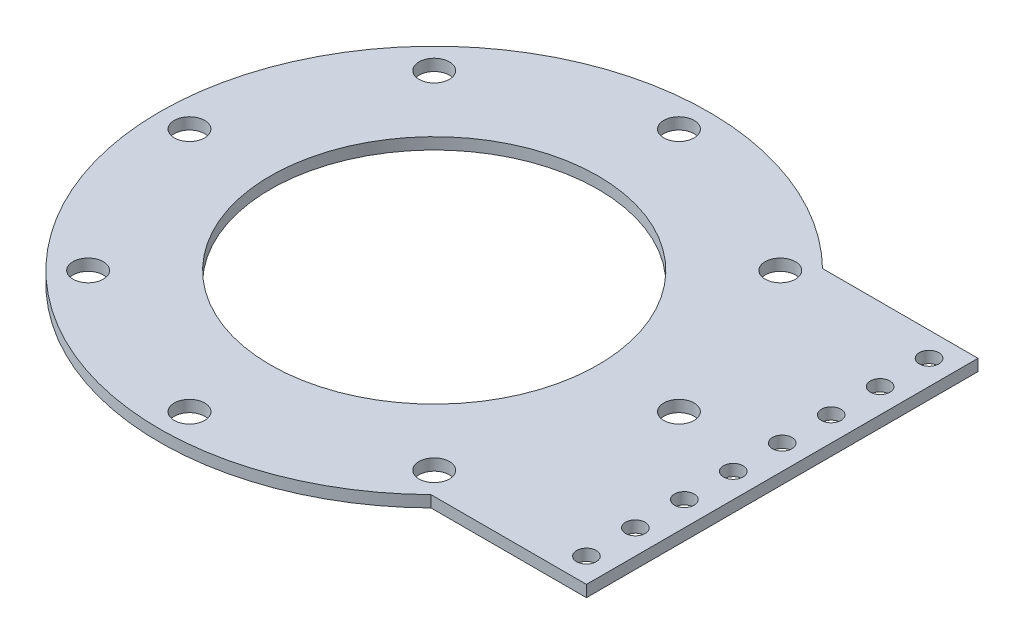
ISO-10303-21;
HEADER;
FILE_DESCRIPTION(('STEP AP214'),'2;1');
FILE_NAME('part.step','',(''),(''),'','','');
FILE_SCHEMA(('AUTOMOTIVE_DESIGN { 1 0 10303 214 1 1 1 1 }'));
ENDSEC;
DATA;
#1=APPLICATION_CONTEXT('core data for automotive mechanical design processes');
#2=APPLICATION_PROTOCOL_DEFINITION('international standard','automotive_design',2000,#1);
#3=PRODUCT_CONTEXT('',#1,'mechanical');
#4=PRODUCT('Part','Part','',(#3));
#5=PRODUCT_RELATED_PRODUCT_CATEGORY('part','',(#4));
#6=PRODUCT_DEFINITION_FORMATION('','',#4);
#7=PRODUCT_DEFINITION_CONTEXT('part definition',#1,'design');
#8=PRODUCT_DEFINITION('design','',#6,#7);
#9=PRODUCT_DEFINITION_SHAPE('','',#8);
#10=(LENGTH_UNIT() NAMED_UNIT(*) SI_UNIT(.MILLI.,.METRE.));
#11=(NAMED_UNIT(*) PLANE_ANGLE_UNIT() SI_UNIT($,.RADIAN.));
#12=(NAMED_UNIT(*) SI_UNIT($,.STERADIAN.) SOLID_ANGLE_UNIT());
#13=UNCERTAINTY_MEASURE_WITH_UNIT(LENGTH_MEASURE(1.E-05),#10,'distance_accuracy_value','');
#14=(GEOMETRIC_REPRESENTATION_CONTEXT(3) GLOBAL_UNCERTAINTY_ASSIGNED_CONTEXT((#13)) GLOBAL_UNIT_ASSIGNED_CONTEXT((#10,
#11,#12)) REPRESENTATION_CONTEXT('',''));
#15=CARTESIAN_POINT('',(0.,0.,0.));
#16=DIRECTION('',(0.,0.,1.));
#17=DIRECTION('',(1.,0.,0.));
#18=AXIS2_PLACEMENT_3D('',#15,#16,#17);
#19=CARTESIAN_POINT('',(0.,0.6,0.));
#20=DIRECTION('',(0.,-1.,0.));
#21=DIRECTION('',(0.,0.,-1.));
#22=AXIS2_PLACEMENT_3D('',#19,#20,#21);
#23=CYLINDRICAL_SURFACE('',#22,14.25);
#24=CARTESIAN_POINT('',(0.,0.,0.));
#25=DIRECTION('',(0.,1.,0.));
#26=DIRECTION('',(0.,0.,1.));
#27=AXIS2_PLACEMENT_3D('',#24,#25,#26);
#28=CIRCLE('',#27,14.25);
#29=CARTESIAN_POINT('',(9.99184167208428,0.,-10.16));
#30=VERTEX_POINT('',#29);
#31=CARTESIAN_POINT('',(9.99184167208428,0.,10.16));
#32=VERTEX_POINT('',#31);
#33=EDGE_CURVE('E151',#30,#32,#28,.T.);
#34=ORIENTED_EDGE('',*,*,#33,.T.);
#35=DIRECTION('',(0.,-1.,0.));
#36=VECTOR('',#35,1.);
#37=CARTESIAN_POINT('',(9.99184167208428,0.6,10.16));
#38=LINE('',#37,#36);
#39=CARTESIAN_POINT('',(9.99184167208428,0.6,10.16));
#40=VERTEX_POINT('',#39);
#41=EDGE_CURVE('E11',#40,#32,#38,.T.);
#42=ORIENTED_EDGE('',*,*,#41,.F.);
#43=CARTESIAN_POINT('',(0.,0.6,0.));
#44=DIRECTION('',(0.,1.,0.));
#45=DIRECTION('',(0.,0.,1.));
#46=AXIS2_PLACEMENT_3D('',#43,#44,#45);
#47=CIRCLE('',#46,14.25);
#48=CARTESIAN_POINT('',(9.99184167208428,0.6,-10.16));
#49=VERTEX_POINT('',#48);
#50=EDGE_CURVE('E86',#49,#40,#47,.T.);
#51=ORIENTED_EDGE('',*,*,#50,.F.);
#52=DIRECTION('',(0.,-1.,0.));
#53=VECTOR('',#52,1.);
#54=CARTESIAN_POINT('',(9.99184167208428,0.6,-10.16));
#55=LINE('',#54,#53);
#56=EDGE_CURVE('E52',#49,#30,#55,.T.);
#57=ORIENTED_EDGE('',*,*,#56,.T.);
#58=EDGE_LOOP('',(#34,#42,#51,#57));
#59=FACE_BOUND('',#58,.T.);
#60=ADVANCED_FACE('F35',(#59),#23,.T.);
#61=CARTESIAN_POINT('',(0.,0.6,10.16));
#62=DIRECTION('',(0.,0.,-1.));
#63=DIRECTION('',(-1.,0.,0.));
#64=AXIS2_PLACEMENT_3D('',#61,#62,#63);
#65=PLANE('',#64);
#66=DIRECTION('',(1.,0.,0.));
#67=VECTOR('',#66,1.);
#68=CARTESIAN_POINT('',(0.,0.,10.16));
#69=LINE('',#68,#67);
#70=CARTESIAN_POINT('',(18.0599999999999,0.,10.16));
#71=VERTEX_POINT('',#70);
#72=EDGE_CURVE('E91',#32,#71,#69,.T.);
#73=ORIENTED_EDGE('',*,*,#72,.T.);
#74=DIRECTION('',(0.,-1.,0.));
#75=VECTOR('',#74,1.);
#76=CARTESIAN_POINT('',(18.0599999999999,0.6,10.16));
#77=LINE('',#76,#75);
#78=CARTESIAN_POINT('',(18.0599999999999,0.6,10.16));
#79=VERTEX_POINT('',#78);
#80=EDGE_CURVE('E44',#79,#71,#77,.T.);
#81=ORIENTED_EDGE('',*,*,#80,.F.);
#82=DIRECTION('',(1.,0.,0.));
#83=VECTOR('',#82,1.);
#84=CARTESIAN_POINT('',(0.,0.6,10.16));
#85=LINE('',#84,#83);
#86=EDGE_CURVE('E77',#40,#79,#85,.T.);
#87=ORIENTED_EDGE('',*,*,#86,.F.);
#88=ORIENTED_EDGE('',*,*,#41,.T.);
#89=EDGE_LOOP('',(#73,#81,#87,#88));
#90=FACE_BOUND('',#89,.T.);
#91=ADVANCED_FACE('F90',(#90),#65,.F.);
#92=CARTESIAN_POINT('',(18.0599999999999,0.6,0.));
#93=DIRECTION('',(1.,0.,0.));
#94=DIRECTION('',(0.,0.,-1.));
#95=AXIS2_PLACEMENT_3D('',#92,#93,#94);
#96=PLANE('',#95);
#97=DIRECTION('',(0.,0.,1.));
#98=VECTOR('',#97,1.);
#99=CARTESIAN_POINT('',(18.0599999999999,0.,0.));
#100=LINE('',#99,#98);
#101=CARTESIAN_POINT('',(18.0599999999999,0.,-10.16));
#102=VERTEX_POINT('',#101);
#103=EDGE_CURVE('E154',#102,#71,#100,.T.);
#104=ORIENTED_EDGE('',*,*,#103,.F.);
#105=DIRECTION('',(0.,-1.,0.));
#106=VECTOR('',#105,1.);
#107=CARTESIAN_POINT('',(18.0599999999999,0.6,-10.16));
#108=LINE('',#107,#106);
#109=CARTESIAN_POINT('',(18.0599999999999,0.6,-10.16));
#110=VERTEX_POINT('',#109);
#111=EDGE_CURVE('E66',#110,#102,#108,.T.);
#112=ORIENTED_EDGE('',*,*,#111,.F.);
#113=DIRECTION('',(0.,0.,1.));
#114=VECTOR('',#113,1.);
#115=CARTESIAN_POINT('',(18.0599999999999,0.6,0.));
#116=LINE('',#115,#114);
#117=EDGE_CURVE('E85',#110,#79,#116,.T.);
#118=ORIENTED_EDGE('',*,*,#117,.T.);
#119=ORIENTED_EDGE('',*,*,#80,.T.);
#120=EDGE_LOOP('',(#104,#112,#118,#119));
#121=FACE_BOUND('',#120,.T.);
#122=ADVANCED_FACE('F94',(#121),#96,.T.);
#123=CARTESIAN_POINT('',(16.7899999999999,0.6,-6.35));
#124=DIRECTION('',(0.,-1.,0.));
#125=DIRECTION('',(0.,0.,-1.));
#126=AXIS2_PLACEMENT_3D('',#123,#124,#125);
#127=CYLINDRICAL_SURFACE('',#126,0.508000000000002);
#128=CARTESIAN_POINT('',(16.7899999999999,0.6,-6.35));
#129=DIRECTION('',(0.,1.,0.));
#130=DIRECTION('',(0.,0.,1.));
#131=AXIS2_PLACEMENT_3D('',#128,#129,#130);
#132=CIRCLE('',#131,0.508000000000002);
#133=CARTESIAN_POINT('',(16.7899999999999,0.6,-5.842));
#134=VERTEX_POINT('',#133);
#135=EDGE_CURVE('E121',#134,#134,#132,.T.);
#136=ORIENTED_EDGE('',*,*,#135,.T.);
#137=EDGE_LOOP('',(#136));
#138=FACE_BOUND('',#137,.T.);
#139=CARTESIAN_POINT('',(16.7899999999999,0.,-6.35));
#140=DIRECTION('',(0.,1.,0.));
#141=DIRECTION('',(0.,0.,1.));
#142=AXIS2_PLACEMENT_3D('',#139,#140,#141);
#143=CIRCLE('',#142,0.508000000000002);
#144=CARTESIAN_POINT('',(16.7899999999999,0.,-5.842));
#145=VERTEX_POINT('',#144);
#146=EDGE_CURVE('E180',#145,#145,#143,.T.);
#147=ORIENTED_EDGE('',*,*,#146,.F.);
#148=EDGE_LOOP('',(#147));
#149=FACE_BOUND('',#148,.T.);
#150=ADVANCED_FACE('F304',(#138,#149),#127,.F.);
#151=CARTESIAN_POINT('',(16.79,0.6,-3.81));
#152=DIRECTION('',(0.,-1.,0.));
#153=DIRECTION('',(0.,0.,-1.));
#154=AXIS2_PLACEMENT_3D('',#151,#152,#153);
#155=CYLINDRICAL_SURFACE('',#154,0.508000000000002);
#156=CARTESIAN_POINT('',(16.79,0.6,-3.81));
#157=DIRECTION('',(0.,1.,0.));
#158=DIRECTION('',(0.,0.,1.));
#159=AXIS2_PLACEMENT_3D('',#156,#157,#158);
#160=CIRCLE('',#159,0.508000000000002);
#161=CARTESIAN_POINT('',(16.79,0.6,-3.302));
#162=VERTEX_POINT('',#161);
#163=EDGE_CURVE('E118',#162,#162,#160,.T.);
#164=ORIENTED_EDGE('',*,*,#163,.T.);
#165=EDGE_LOOP('',(#164));
#166=FACE_BOUND('',#165,.T.);
#167=CARTESIAN_POINT('',(16.79,0.,-3.81));
#168=DIRECTION('',(0.,1.,0.));
#169=DIRECTION('',(0.,0.,1.));
#170=AXIS2_PLACEMENT_3D('',#167,#168,#169);
#171=CIRCLE('',#170,0.508000000000002);
#172=CARTESIAN_POINT('',(16.79,0.,-3.302));
#173=VERTEX_POINT('',#172);
#174=EDGE_CURVE('E177',#173,#173,#171,.T.);
#175=ORIENTED_EDGE('',*,*,#174,.F.);
#176=EDGE_LOOP('',(#175));
#177=FACE_BOUND('',#176,.T.);
#178=ADVANCED_FACE('F306',(#166,#177),#155,.F.);
#179=CARTESIAN_POINT('',(16.79,0.6,-1.27));
#180=DIRECTION('',(0.,-1.,0.));
#181=DIRECTION('',(0.,0.,-1.));
#182=AXIS2_PLACEMENT_3D('',#179,#180,#181);
#183=CYLINDRICAL_SURFACE('',#182,0.508000000000002);
#184=CARTESIAN_POINT('',(16.79,0.6,-1.27));
#185=DIRECTION('',(0.,1.,0.));
#186=DIRECTION('',(0.,0.,1.));
#187=AXIS2_PLACEMENT_3D('',#184,#185,#186);
#188=CIRCLE('',#187,0.508000000000002);
#189=CARTESIAN_POINT('',(16.79,0.6,-0.761999999999998));
#190=VERTEX_POINT('',#189);
#191=EDGE_CURVE('E115',#190,#190,#188,.T.);
#192=ORIENTED_EDGE('',*,*,#191,.T.);
#193=EDGE_LOOP('',(#192));
#194=FACE_BOUND('',#193,.T.);
#195=CARTESIAN_POINT('',(16.79,0.,-1.27));
#196=DIRECTION('',(0.,1.,0.));
#197=DIRECTION('',(0.,0.,1.));
#198=AXIS2_PLACEMENT_3D('',#195,#196,#197);
#199=CIRCLE('',#198,0.508000000000002);
#200=CARTESIAN_POINT('',(16.79,0.,-0.761999999999998));
#201=VERTEX_POINT('',#200);
#202=EDGE_CURVE('E174',#201,#201,#199,.T.);
#203=ORIENTED_EDGE('',*,*,#202,.F.);
#204=EDGE_LOOP('',(#203));
#205=FACE_BOUND('',#204,.T.);
#206=ADVANCED_FACE('F313',(#194,#205),#183,.F.);
#207=CARTESIAN_POINT('',(16.79,0.6,1.27));
#208=DIRECTION('',(0.,-1.,0.));
#209=DIRECTION('',(0.,0.,-1.));
#210=AXIS2_PLACEMENT_3D('',#207,#208,#209);
#211=CYLINDRICAL_SURFACE('',#210,0.508000000000002);
#212=CARTESIAN_POINT('',(16.79,0.6,1.27));
#213=DIRECTION('',(0.,1.,0.));
#214=DIRECTION('',(0.,0.,1.));
#215=AXIS2_PLACEMENT_3D('',#212,#213,#214);
#216=CIRCLE('',#215,0.508000000000002);
#217=CARTESIAN_POINT('',(16.79,0.6,1.778));
#218=VERTEX_POINT('',#217);
#219=EDGE_CURVE('E112',#218,#218,#216,.T.);
#220=ORIENTED_EDGE('',*,*,#219,.T.);
#221=EDGE_LOOP('',(#220));
#222=FACE_BOUND('',#221,.T.);
#223=CARTESIAN_POINT('',(16.79,0.,1.27));
#224=DIRECTION('',(0.,1.,0.));
#225=DIRECTION('',(0.,0.,1.));
#226=AXIS2_PLACEMENT_3D('',#223,#224,#225);
#227=CIRCLE('',#226,0.508000000000002);
#228=CARTESIAN_POINT('',(16.79,0.,1.778));
#229=VERTEX_POINT('',#228);
#230=EDGE_CURVE('E171',#229,#229,#227,.T.);
#231=ORIENTED_EDGE('',*,*,#230,.F.);
#232=EDGE_LOOP('',(#231));
#233=FACE_BOUND('',#232,.T.);
#234=ADVANCED_FACE('F319',(#222,#233),#211,.F.);
#235=CARTESIAN_POINT('',(16.79,0.6,3.81));
#236=DIRECTION('',(0.,-1.,0.));
#237=DIRECTION('',(0.,0.,-1.));
#238=AXIS2_PLACEMENT_3D('',#235,#236,#237);
#239=CYLINDRICAL_SURFACE('',#238,0.508000000000002);
#240=CARTESIAN_POINT('',(16.79,0.6,3.81));
#241=DIRECTION('',(0.,1.,0.));
#242=DIRECTION('',(0.,0.,1.));
#243=AXIS2_PLACEMENT_3D('',#240,#241,#242);
#244=CIRCLE('',#243,0.508000000000002);
#245=CARTESIAN_POINT('',(16.79,0.6,4.318));
#246=VERTEX_POINT('',#245);
#247=EDGE_CURVE('E109',#246,#246,#244,.T.);
#248=ORIENTED_EDGE('',*,*,#247,.T.);
#249=EDGE_LOOP('',(#248));
#250=FACE_BOUND('',#249,.T.);
#251=CARTESIAN_POINT('',(16.79,0.,3.81));
#252=DIRECTION('',(0.,1.,0.));
#253=DIRECTION('',(0.,0.,1.));
#254=AXIS2_PLACEMENT_3D('',#251,#252,#253);
#255=CIRCLE('',#254,0.508000000000002);
#256=CARTESIAN_POINT('',(16.79,0.,4.318));
#257=VERTEX_POINT('',#256);
#258=EDGE_CURVE('E168',#257,#257,#255,.T.);
#259=ORIENTED_EDGE('',*,*,#258,.F.);
#260=EDGE_LOOP('',(#259));
#261=FACE_BOUND('',#260,.T.);
#262=ADVANCED_FACE('F323',(#250,#261),#239,.F.);
#263=CARTESIAN_POINT('',(16.7900000000001,0.6,6.35));
#264=DIRECTION('',(0.,-1.,0.));
#265=DIRECTION('',(0.,0.,-1.));
#266=AXIS2_PLACEMENT_3D('',#263,#264,#265);
#267=CYLINDRICAL_SURFACE('',#266,0.508000000000002);
#268=CARTESIAN_POINT('',(16.7900000000001,0.6,6.35));
#269=DIRECTION('',(0.,1.,0.));
#270=DIRECTION('',(0.,0.,1.));
#271=AXIS2_PLACEMENT_3D('',#268,#269,#270);
#272=CIRCLE('',#271,0.508000000000002);
#273=CARTESIAN_POINT('',(16.7900000000001,0.6,6.858));
#274=VERTEX_POINT('',#273);
#275=EDGE_CURVE('E106',#274,#274,#272,.T.);
#276=ORIENTED_EDGE('',*,*,#275,.T.);
#277=EDGE_LOOP('',(#276));
#278=FACE_BOUND('',#277,.T.);
#279=CARTESIAN_POINT('',(16.7900000000001,0.,6.35));
#280=DIRECTION('',(0.,1.,0.));
#281=DIRECTION('',(0.,0.,1.));
#282=AXIS2_PLACEMENT_3D('',#279,#280,#281);
#283=CIRCLE('',#282,0.508000000000002);
#284=CARTESIAN_POINT('',(16.7900000000001,0.,6.858));
#285=VERTEX_POINT('',#284);
#286=EDGE_CURVE('E165',#285,#285,#283,.T.);
#287=ORIENTED_EDGE('',*,*,#286,.F.);
#288=EDGE_LOOP('',(#287));
#289=FACE_BOUND('',#288,.T.);
#290=ADVANCED_FACE('F327',(#278,#289),#267,.F.);
#291=CARTESIAN_POINT('',(16.7900000000001,0.6,8.89));
#292=DIRECTION('',(0.,-1.,0.));
#293=DIRECTION('',(0.,0.,-1.));
#294=AXIS2_PLACEMENT_3D('',#291,#292,#293);
#295=CYLINDRICAL_SURFACE('',#294,0.508000000000002);
#296=CARTESIAN_POINT('',(16.7900000000001,0.6,8.89));
#297=DIRECTION('',(0.,1.,0.));
#298=DIRECTION('',(0.,0.,1.));
#299=AXIS2_PLACEMENT_3D('',#296,#297,#298);
#300=CIRCLE('',#299,0.508000000000002);
#301=CARTESIAN_POINT('',(16.7900000000001,0.6,9.398));
#302=VERTEX_POINT('',#301);
#303=EDGE_CURVE('E103',#302,#302,#300,.T.);
#304=ORIENTED_EDGE('',*,*,#303,.T.);
#305=EDGE_LOOP('',(#304));
#306=FACE_BOUND('',#305,.T.);
#307=CARTESIAN_POINT('',(16.7900000000001,0.,8.89));
#308=DIRECTION('',(0.,1.,0.));
#309=DIRECTION('',(0.,0.,1.));
#310=AXIS2_PLACEMENT_3D('',#307,#308,#309);
#311=CIRCLE('',#310,0.508000000000002);
#312=CARTESIAN_POINT('',(16.7900000000001,0.,9.398));
#313=VERTEX_POINT('',#312);
#314=EDGE_CURVE('E162',#313,#313,#311,.T.);
#315=ORIENTED_EDGE('',*,*,#314,.F.);
#316=EDGE_LOOP('',(#315));
#317=FACE_BOUND('',#316,.T.);
#318=ADVANCED_FACE('F331',(#306,#317),#295,.F.);
#319=CARTESIAN_POINT('',(12.7,0.6,1.33025439009923E-13));
#320=DIRECTION('',(0.,-1.,0.));
#321=DIRECTION('',(0.,0.,-1.));
#322=AXIS2_PLACEMENT_3D('',#319,#320,#321);
#323=CYLINDRICAL_SURFACE('',#322,0.787399999999999);
#324=CARTESIAN_POINT('',(12.7,0.6,1.33025439009923E-13));
#325=DIRECTION('',(0.,1.,0.));
#326=DIRECTION('',(0.,0.,1.));
#327=AXIS2_PLACEMENT_3D('',#324,#325,#326);
#328=CIRCLE('',#327,0.787399999999999);
#329=CARTESIAN_POINT('',(12.7,0.6,0.787400000000132));
#330=VERTEX_POINT('',#329);
#331=EDGE_CURVE('E97',#330,#330,#328,.T.);
#332=ORIENTED_EDGE('',*,*,#331,.T.);
#333=EDGE_LOOP('',(#332));
#334=FACE_BOUND('',#333,.T.);
#335=CARTESIAN_POINT('',(12.7,0.,1.33025439009923E-13));
#336=DIRECTION('',(0.,1.,0.));
#337=DIRECTION('',(0.,0.,1.));
#338=AXIS2_PLACEMENT_3D('',#335,#336,#337);
#339=CIRCLE('',#338,0.787399999999999);
#340=CARTESIAN_POINT('',(12.7,0.,0.787400000000132));
#341=VERTEX_POINT('',#340);
#342=EDGE_CURVE('E159',#341,#341,#339,.T.);
#343=ORIENTED_EDGE('',*,*,#342,.F.);
#344=EDGE_LOOP('',(#343));
#345=FACE_BOUND('',#344,.T.);
#346=ADVANCED_FACE('F335',(#334,#345),#323,.F.);
#347=CARTESIAN_POINT('',(0.,0.6,-10.16));
#348=DIRECTION('',(0.,0.,-1.));
#349=DIRECTION('',(-1.,0.,0.));
#350=AXIS2_PLACEMENT_3D('',#347,#348,#349);
#351=PLANE('',#350);
#352=DIRECTION('',(1.,0.,0.));
#353=VECTOR('',#352,1.);
#354=CARTESIAN_POINT('',(0.,0.,-10.16));
#355=LINE('',#354,#353);
#356=EDGE_CURVE('E156',#30,#102,#355,.T.);
#357=ORIENTED_EDGE('',*,*,#356,.F.);
#358=ORIENTED_EDGE('',*,*,#56,.F.);
#359=DIRECTION('',(1.,0.,0.));
#360=VECTOR('',#359,1.);
#361=CARTESIAN_POINT('',(0.,0.6,-10.16));
#362=LINE('',#361,#360);
#363=EDGE_CURVE('E95',#49,#110,#362,.T.);
#364=ORIENTED_EDGE('',*,*,#363,.T.);
#365=ORIENTED_EDGE('',*,*,#111,.T.);
#366=EDGE_LOOP('',(#357,#358,#364,#365));
#367=FACE_BOUND('',#366,.T.);
#368=ADVANCED_FACE('F245',(#367),#351,.T.);
#369=CARTESIAN_POINT('',(0.,0.6,0.));
#370=DIRECTION('',(0.,-1.,0.));
#371=DIRECTION('',(0.,0.,-1.));
#372=AXIS2_PLACEMENT_3D('',#369,#370,#371);
#373=CYLINDRICAL_SURFACE('',#372,8.5);
#374=CARTESIAN_POINT('',(0.,0.6,0.));
#375=DIRECTION('',(0.,1.,0.));
#376=DIRECTION('',(0.,0.,1.));
#377=AXIS2_PLACEMENT_3D('',#374,#375,#376);
#378=CIRCLE('',#377,8.5);
#379=CARTESIAN_POINT('',(0.,0.6,8.5));
#380=VERTEX_POINT('',#379);
#381=EDGE_CURVE('E213',#380,#380,#378,.T.);
#382=ORIENTED_EDGE('',*,*,#381,.T.);
#383=EDGE_LOOP('',(#382));
#384=FACE_BOUND('',#383,.T.);
#385=CARTESIAN_POINT('',(0.,0.,0.));
#386=DIRECTION('',(0.,1.,0.));
#387=DIRECTION('',(0.,0.,1.));
#388=AXIS2_PLACEMENT_3D('',#385,#386,#387);
#389=CIRCLE('',#388,8.5);
#390=CARTESIAN_POINT('',(0.,0.,8.5));
#391=VERTEX_POINT('',#390);
#392=EDGE_CURVE('E148',#391,#391,#389,.T.);
#393=ORIENTED_EDGE('',*,*,#392,.F.);
#394=EDGE_LOOP('',(#393));
#395=FACE_BOUND('',#394,.T.);
#396=ADVANCED_FACE('F217',(#384,#395),#373,.F.);
#397=CARTESIAN_POINT('',(-8.98025612106917,0.6,8.98025612106914));
#398=DIRECTION('',(0.,-1.,0.));
#399=DIRECTION('',(0.,0.,-1.));
#400=AXIS2_PLACEMENT_3D('',#397,#398,#399);
#401=CYLINDRICAL_SURFACE('',#400,0.7874);
#402=CARTESIAN_POINT('',(-8.98025612106917,0.6,8.98025612106914));
#403=DIRECTION('',(0.,1.,0.));
#404=DIRECTION('',(0.,0.,1.));
#405=AXIS2_PLACEMENT_3D('',#402,#403,#404);
#406=CIRCLE('',#405,0.7874);
#407=CARTESIAN_POINT('',(-8.98025612106917,0.6,9.76765612106914));
#408=VERTEX_POINT('',#407);
#409=EDGE_CURVE('E210',#408,#408,#406,.T.);
#410=ORIENTED_EDGE('',*,*,#409,.T.);
#411=EDGE_LOOP('',(#410));
#412=FACE_BOUND('',#411,.T.);
#413=CARTESIAN_POINT('',(-8.98025612106917,0.,8.98025612106914));
#414=DIRECTION('',(0.,1.,0.));
#415=DIRECTION('',(0.,0.,1.));
#416=AXIS2_PLACEMENT_3D('',#413,#414,#415);
#417=CIRCLE('',#416,0.7874);
#418=CARTESIAN_POINT('',(-8.98025612106917,0.,9.76765612106914));
#419=VERTEX_POINT('',#418);
#420=EDGE_CURVE('E145',#419,#419,#417,.T.);
#421=ORIENTED_EDGE('',*,*,#420,.F.);
#422=EDGE_LOOP('',(#421));
#423=FACE_BOUND('',#422,.T.);
#424=ADVANCED_FACE('F244',(#412,#423),#401,.F.);
#425=CARTESIAN_POINT('',(-12.7,0.6,0.));
#426=DIRECTION('',(0.,-1.,0.));
#427=DIRECTION('',(0.,0.,-1.));
#428=AXIS2_PLACEMENT_3D('',#425,#426,#427);
#429=CYLINDRICAL_SURFACE('',#428,0.787399999999999);
#430=CARTESIAN_POINT('',(-12.7,0.6,0.));
#431=DIRECTION('',(0.,1.,0.));
#432=DIRECTION('',(0.,0.,1.));
#433=AXIS2_PLACEMENT_3D('',#430,#431,#432);
#434=CIRCLE('',#433,0.787399999999999);
#435=CARTESIAN_POINT('',(-12.7,0.6,0.787399999999955));
#436=VERTEX_POINT('',#435);
#437=EDGE_CURVE('E207',#436,#436,#434,.T.);
#438=ORIENTED_EDGE('',*,*,#437,.T.);
#439=EDGE_LOOP('',(#438));
#440=FACE_BOUND('',#439,.T.);
#441=CARTESIAN_POINT('',(-12.7,0.,0.));
#442=DIRECTION('',(0.,1.,0.));
#443=DIRECTION('',(0.,0.,1.));
#444=AXIS2_PLACEMENT_3D('',#441,#442,#443);
#445=CIRCLE('',#444,0.787399999999999);
#446=CARTESIAN_POINT('',(-12.7,0.,0.787399999999955));
#447=VERTEX_POINT('',#446);
#448=EDGE_CURVE('E142',#447,#447,#445,.T.);
#449=ORIENTED_EDGE('',*,*,#448,.F.);
#450=EDGE_LOOP('',(#449));
#451=FACE_BOUND('',#450,.T.);
#452=ADVANCED_FACE('F248',(#440,#451),#429,.F.);
#453=CARTESIAN_POINT('',(-8.98025612106911,0.6,-8.9802561210692));
#454=DIRECTION('',(0.,-1.,0.));
#455=DIRECTION('',(0.,0.,-1.));
#456=AXIS2_PLACEMENT_3D('',#453,#454,#455);
#457=CYLINDRICAL_SURFACE('',#456,0.7874);
#458=CARTESIAN_POINT('',(-8.98025612106911,0.6,-8.9802561210692));
#459=DIRECTION('',(0.,1.,0.));
#460=DIRECTION('',(0.,0.,1.));
#461=AXIS2_PLACEMENT_3D('',#458,#459,#460);
#462=CIRCLE('',#461,0.7874);
#463=CARTESIAN_POINT('',(-8.98025612106911,0.6,-8.1928561210692));
#464=VERTEX_POINT('',#463);
#465=EDGE_CURVE('E204',#464,#464,#462,.T.);
#466=ORIENTED_EDGE('',*,*,#465,.T.);
#467=EDGE_LOOP('',(#466));
#468=FACE_BOUND('',#467,.T.);
#469=CARTESIAN_POINT('',(-8.98025612106911,0.,-8.9802561210692));
#470=DIRECTION('',(0.,1.,0.));
#471=DIRECTION('',(0.,0.,1.));
#472=AXIS2_PLACEMENT_3D('',#469,#470,#471);
#473=CIRCLE('',#472,0.7874);
#474=CARTESIAN_POINT('',(-8.98025612106911,0.,-8.1928561210692));
#475=VERTEX_POINT('',#474);
#476=EDGE_CURVE('E139',#475,#475,#473,.T.);
#477=ORIENTED_EDGE('',*,*,#476,.F.);
#478=EDGE_LOOP('',(#477));
#479=FACE_BOUND('',#478,.T.);
#480=ADVANCED_FACE('F252',(#468,#479),#457,.F.);
#481=CARTESIAN_POINT('',(0.,0.6,-12.7));
#482=DIRECTION('',(0.,-1.,0.));
#483=DIRECTION('',(0.,0.,-1.));
#484=AXIS2_PLACEMENT_3D('',#481,#482,#483);
#485=CYLINDRICAL_SURFACE('',#484,0.7874);
#486=CARTESIAN_POINT('',(0.,0.6,-12.7));
#487=DIRECTION('',(0.,1.,0.));
#488=DIRECTION('',(0.,0.,1.));
#489=AXIS2_PLACEMENT_3D('',#486,#487,#488);
#490=CIRCLE('',#489,0.7874);
#491=CARTESIAN_POINT('',(0.,0.6,-11.9126));
#492=VERTEX_POINT('',#491);
#493=EDGE_CURVE('E201',#492,#492,#490,.T.);
#494=ORIENTED_EDGE('',*,*,#493,.T.);
#495=EDGE_LOOP('',(#494));
#496=FACE_BOUND('',#495,.T.);
#497=CARTESIAN_POINT('',(0.,0.,-12.7));
#498=DIRECTION('',(0.,1.,0.));
#499=DIRECTION('',(0.,0.,1.));
#500=AXIS2_PLACEMENT_3D('',#497,#498,#499);
#501=CIRCLE('',#500,0.7874);
#502=CARTESIAN_POINT('',(0.,0.,-11.9126));
#503=VERTEX_POINT('',#502);
#504=EDGE_CURVE('E136',#503,#503,#501,.T.);
#505=ORIENTED_EDGE('',*,*,#504,.F.);
#506=EDGE_LOOP('',(#505));
#507=FACE_BOUND('',#506,.T.);
#508=ADVANCED_FACE('F256',(#496,#507),#485,.F.);
#509=CARTESIAN_POINT('',(8.98025612106924,0.6,-8.98025612106908));
#510=DIRECTION('',(0.,-1.,0.));
#511=DIRECTION('',(0.,0.,-1.));
#512=AXIS2_PLACEMENT_3D('',#509,#510,#511);
#513=CYLINDRICAL_SURFACE('',#512,0.787399999999999);
#514=CARTESIAN_POINT('',(8.98025612106924,0.6,-8.98025612106908));
#515=DIRECTION('',(0.,1.,0.));
#516=DIRECTION('',(0.,0.,1.));
#517=AXIS2_PLACEMENT_3D('',#514,#515,#516);
#518=CIRCLE('',#517,0.787399999999999);
#519=CARTESIAN_POINT('',(8.98025612106924,0.6,-8.19285612106908));
#520=VERTEX_POINT('',#519);
#521=EDGE_CURVE('E196',#520,#520,#518,.T.);
#522=ORIENTED_EDGE('',*,*,#521,.T.);
#523=EDGE_LOOP('',(#522));
#524=FACE_BOUND('',#523,.T.);
#525=CARTESIAN_POINT('',(8.98025612106924,0.,-8.98025612106908));
#526=DIRECTION('',(0.,1.,0.));
#527=DIRECTION('',(0.,0.,1.));
#528=AXIS2_PLACEMENT_3D('',#525,#526,#527);
#529=CIRCLE('',#528,0.787399999999999);
#530=CARTESIAN_POINT('',(8.98025612106924,0.,-8.19285612106908));
#531=VERTEX_POINT('',#530);
#532=EDGE_CURVE('E133',#531,#531,#529,.T.);
#533=ORIENTED_EDGE('',*,*,#532,.F.);
#534=EDGE_LOOP('',(#533));
#535=FACE_BOUND('',#534,.T.);
#536=ADVANCED_FACE('F260',(#524,#535),#513,.F.);
#537=CARTESIAN_POINT('',(8.98025612106905,0.6,8.98025612106927));
#538=DIRECTION('',(0.,-1.,0.));
#539=DIRECTION('',(0.,0.,-1.));
#540=AXIS2_PLACEMENT_3D('',#537,#538,#539);
#541=CYLINDRICAL_SURFACE('',#540,0.7874);
#542=CARTESIAN_POINT('',(8.98025612106905,0.6,8.98025612106927));
#543=DIRECTION('',(0.,1.,0.));
#544=DIRECTION('',(0.,0.,1.));
#545=AXIS2_PLACEMENT_3D('',#542,#543,#544);
#546=CIRCLE('',#545,0.7874);
#547=CARTESIAN_POINT('',(8.98025612106905,0.6,9.76765612106926));
#548=VERTEX_POINT('',#547);
#549=EDGE_CURVE('E191',#548,#548,#546,.T.);
#550=ORIENTED_EDGE('',*,*,#549,.T.);
#551=EDGE_LOOP('',(#550));
#552=FACE_BOUND('',#551,.T.);
#553=CARTESIAN_POINT('',(8.98025612106905,0.,8.98025612106927));
#554=DIRECTION('',(0.,1.,0.));
#555=DIRECTION('',(0.,0.,1.));
#556=AXIS2_PLACEMENT_3D('',#553,#554,#555);
#557=CIRCLE('',#556,0.7874);
#558=CARTESIAN_POINT('',(8.98025612106905,0.,9.76765612106926));
#559=VERTEX_POINT('',#558);
#560=EDGE_CURVE('E130',#559,#559,#557,.T.);
#561=ORIENTED_EDGE('',*,*,#560,.F.);
#562=EDGE_LOOP('',(#561));
#563=FACE_BOUND('',#562,.T.);
#564=ADVANCED_FACE('F263',(#552,#563),#541,.F.);
#565=CARTESIAN_POINT('',(0.,0.6,12.7));
#566=DIRECTION('',(0.,-1.,0.));
#567=DIRECTION('',(0.,0.,-1.));
#568=AXIS2_PLACEMENT_3D('',#565,#566,#567);
#569=CYLINDRICAL_SURFACE('',#568,0.7874);
#570=CARTESIAN_POINT('',(0.,0.6,12.7));
#571=DIRECTION('',(0.,1.,0.));
#572=DIRECTION('',(0.,0.,1.));
#573=AXIS2_PLACEMENT_3D('',#570,#571,#572);
#574=CIRCLE('',#573,0.7874);
#575=CARTESIAN_POINT('',(0.,0.6,13.4874));
#576=VERTEX_POINT('',#575);
#577=EDGE_CURVE('E186',#576,#576,#574,.T.);
#578=ORIENTED_EDGE('',*,*,#577,.T.);
#579=EDGE_LOOP('',(#578));
#580=FACE_BOUND('',#579,.T.);
#581=CARTESIAN_POINT('',(0.,0.,12.7));
#582=DIRECTION('',(0.,1.,0.));
#583=DIRECTION('',(0.,0.,1.));
#584=AXIS2_PLACEMENT_3D('',#581,#582,#583);
#585=CIRCLE('',#584,0.7874);
#586=CARTESIAN_POINT('',(0.,0.,13.4874));
#587=VERTEX_POINT('',#586);
#588=EDGE_CURVE('E127',#587,#587,#585,.T.);
#589=ORIENTED_EDGE('',*,*,#588,.F.);
#590=EDGE_LOOP('',(#589));
#591=FACE_BOUND('',#590,.T.);
#592=ADVANCED_FACE('F37',(#580,#591),#569,.F.);
#593=CARTESIAN_POINT('',(16.7899999999999,0.6,-8.89));
#594=DIRECTION('',(0.,-1.,0.));
#595=DIRECTION('',(0.,0.,-1.));
#596=AXIS2_PLACEMENT_3D('',#593,#594,#595);
#597=CYLINDRICAL_SURFACE('',#596,0.508000000000002);
#598=CARTESIAN_POINT('',(16.7899999999999,0.6,-8.89));
#599=DIRECTION('',(0.,1.,0.));
#600=DIRECTION('',(0.,0.,1.));
#601=AXIS2_PLACEMENT_3D('',#598,#599,#600);
#602=CIRCLE('',#601,0.508000000000002);
#603=CARTESIAN_POINT('',(16.7899999999999,0.6,-8.382));
#604=VERTEX_POINT('',#603);
#605=EDGE_CURVE('E124',#604,#604,#602,.T.);
#606=ORIENTED_EDGE('',*,*,#605,.T.);
#607=EDGE_LOOP('',(#606));
#608=FACE_BOUND('',#607,.T.);
#609=CARTESIAN_POINT('',(16.7899999999999,0.,-8.89));
#610=DIRECTION('',(0.,1.,0.));
#611=DIRECTION('',(0.,0.,1.));
#612=AXIS2_PLACEMENT_3D('',#609,#610,#611);
#613=CIRCLE('',#612,0.508000000000002);
#614=CARTESIAN_POINT('',(16.7899999999999,0.,-8.382));
#615=VERTEX_POINT('',#614);
#616=EDGE_CURVE('E183',#615,#615,#613,.T.);
#617=ORIENTED_EDGE('',*,*,#616,.F.);
#618=EDGE_LOOP('',(#617));
#619=FACE_BOUND('',#618,.T.);
#620=ADVANCED_FACE('F222',(#608,#619),#597,.F.);
#621=CARTESIAN_POINT('',(0.,0.6,0.));
#622=DIRECTION('',(0.,1.,0.));
#623=DIRECTION('',(0.,0.,1.));
#624=AXIS2_PLACEMENT_3D('',#621,#622,#623);
#625=PLANE('',#624);
#626=ORIENTED_EDGE('',*,*,#577,.F.);
#627=EDGE_LOOP('',(#626));
#628=FACE_BOUND('',#627,.T.);
#629=ORIENTED_EDGE('',*,*,#549,.F.);
#630=EDGE_LOOP('',(#629));
#631=FACE_BOUND('',#630,.T.);
#632=ORIENTED_EDGE('',*,*,#521,.F.);
#633=EDGE_LOOP('',(#632));
#634=FACE_BOUND('',#633,.T.);
#635=ORIENTED_EDGE('',*,*,#493,.F.);
#636=EDGE_LOOP('',(#635));
#637=FACE_BOUND('',#636,.T.);
#638=ORIENTED_EDGE('',*,*,#465,.F.);
#639=EDGE_LOOP('',(#638));
#640=FACE_BOUND('',#639,.T.);
#641=ORIENTED_EDGE('',*,*,#437,.F.);
#642=EDGE_LOOP('',(#641));
#643=FACE_BOUND('',#642,.T.);
#644=ORIENTED_EDGE('',*,*,#409,.F.);
#645=EDGE_LOOP('',(#644));
#646=FACE_BOUND('',#645,.T.);
#647=ORIENTED_EDGE('',*,*,#381,.F.);
#648=EDGE_LOOP('',(#647));
#649=FACE_BOUND('',#648,.T.);
#650=ORIENTED_EDGE('',*,*,#50,.T.);
#651=ORIENTED_EDGE('',*,*,#86,.T.);
#652=ORIENTED_EDGE('',*,*,#117,.F.);
#653=ORIENTED_EDGE('',*,*,#363,.F.);
#654=EDGE_LOOP('',(#650,#651,#652,#653));
#655=FACE_BOUND('',#654,.T.);
#656=ORIENTED_EDGE('',*,*,#331,.F.);
#657=EDGE_LOOP('',(#656));
#658=FACE_BOUND('',#657,.T.);
#659=ORIENTED_EDGE('',*,*,#303,.F.);
#660=EDGE_LOOP('',(#659));
#661=FACE_BOUND('',#660,.T.);
#662=ORIENTED_EDGE('',*,*,#275,.F.);
#663=EDGE_LOOP('',(#662));
#664=FACE_BOUND('',#663,.T.);
#665=ORIENTED_EDGE('',*,*,#247,.F.);
#666=EDGE_LOOP('',(#665));
#667=FACE_BOUND('',#666,.T.);
#668=ORIENTED_EDGE('',*,*,#219,.F.);
#669=EDGE_LOOP('',(#668));
#670=FACE_BOUND('',#669,.T.);
#671=ORIENTED_EDGE('',*,*,#191,.F.);
#672=EDGE_LOOP('',(#671));
#673=FACE_BOUND('',#672,.T.);
#674=ORIENTED_EDGE('',*,*,#163,.F.);
#675=EDGE_LOOP('',(#674));
#676=FACE_BOUND('',#675,.T.);
#677=ORIENTED_EDGE('',*,*,#135,.F.);
#678=EDGE_LOOP('',(#677));
#679=FACE_BOUND('',#678,.T.);
#680=ORIENTED_EDGE('',*,*,#605,.F.);
#681=EDGE_LOOP('',(#680));
#682=FACE_BOUND('',#681,.T.);
#683=ADVANCED_FACE('F81',(#628,#631,#634,#637,#640,#643,#646,#649,#655,#658,#661,#664,#667,#670,
#673,#676,#679,#682),#625,.T.);
#684=CARTESIAN_POINT('',(0.,0.,0.));
#685=DIRECTION('',(0.,1.,0.));
#686=DIRECTION('',(0.,0.,1.));
#687=AXIS2_PLACEMENT_3D('',#684,#685,#686);
#688=PLANE('',#687);
#689=ORIENTED_EDGE('',*,*,#588,.T.);
#690=EDGE_LOOP('',(#689));
#691=FACE_BOUND('',#690,.T.);
#692=ORIENTED_EDGE('',*,*,#560,.T.);
#693=EDGE_LOOP('',(#692));
#694=FACE_BOUND('',#693,.T.);
#695=ORIENTED_EDGE('',*,*,#532,.T.);
#696=EDGE_LOOP('',(#695));
#697=FACE_BOUND('',#696,.T.);
#698=ORIENTED_EDGE('',*,*,#504,.T.);
#699=EDGE_LOOP('',(#698));
#700=FACE_BOUND('',#699,.T.);
#701=ORIENTED_EDGE('',*,*,#476,.T.);
#702=EDGE_LOOP('',(#701));
#703=FACE_BOUND('',#702,.T.);
#704=ORIENTED_EDGE('',*,*,#448,.T.);
#705=EDGE_LOOP('',(#704));
#706=FACE_BOUND('',#705,.T.);
#707=ORIENTED_EDGE('',*,*,#420,.T.);
#708=EDGE_LOOP('',(#707));
#709=FACE_BOUND('',#708,.T.);
#710=ORIENTED_EDGE('',*,*,#392,.T.);
#711=EDGE_LOOP('',(#710));
#712=FACE_BOUND('',#711,.T.);
#713=ORIENTED_EDGE('',*,*,#33,.F.);
#714=ORIENTED_EDGE('',*,*,#356,.T.);
#715=ORIENTED_EDGE('',*,*,#103,.T.);
#716=ORIENTED_EDGE('',*,*,#72,.F.);
#717=EDGE_LOOP('',(#713,#714,#715,#716));
#718=FACE_BOUND('',#717,.T.);
#719=ORIENTED_EDGE('',*,*,#342,.T.);
#720=EDGE_LOOP('',(#719));
#721=FACE_BOUND('',#720,.T.);
#722=ORIENTED_EDGE('',*,*,#314,.T.);
#723=EDGE_LOOP('',(#722));
#724=FACE_BOUND('',#723,.T.);
#725=ORIENTED_EDGE('',*,*,#286,.T.);
#726=EDGE_LOOP('',(#725));
#727=FACE_BOUND('',#726,.T.);
#728=ORIENTED_EDGE('',*,*,#258,.T.);
#729=EDGE_LOOP('',(#728));
#730=FACE_BOUND('',#729,.T.);
#731=ORIENTED_EDGE('',*,*,#230,.T.);
#732=EDGE_LOOP('',(#731));
#733=FACE_BOUND('',#732,.T.);
#734=ORIENTED_EDGE('',*,*,#202,.T.);
#735=EDGE_LOOP('',(#734));
#736=FACE_BOUND('',#735,.T.);
#737=ORIENTED_EDGE('',*,*,#174,.T.);
#738=EDGE_LOOP('',(#737));
#739=FACE_BOUND('',#738,.T.);
#740=ORIENTED_EDGE('',*,*,#146,.T.);
#741=EDGE_LOOP('',(#740));
#742=FACE_BOUND('',#741,.T.);
#743=ORIENTED_EDGE('',*,*,#616,.T.);
#744=EDGE_LOOP('',(#743));
#745=FACE_BOUND('',#744,.T.);
#746=ADVANCED_FACE('F221',(#691,#694,#697,#700,#703,#706,#709,#712,#718,#721,#724,#727,#730,
#733,#736,#739,#742,#745),#688,.F.);
#747=CLOSED_SHELL('',(#60,#91,#122,#150,#178,#206,#234,#262,#290,#318,#346,#368,#396,#424,#452,
#480,#508,#536,#564,#592,#620,#683,#746));
#748=MANIFOLD_SOLID_BREP('B2',#747);
#749=ADVANCED_BREP_SHAPE_REPRESENTATION('',(#18,#748),#14);
#750=SHAPE_DEFINITION_REPRESENTATION(#9,#749);
ENDSEC;
END-ISO-10303-21;
